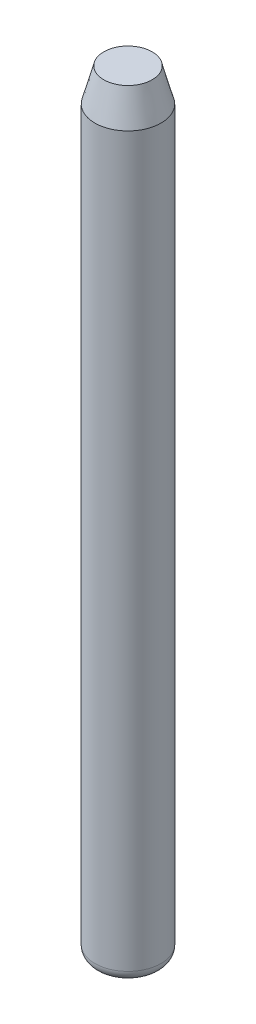
ISO-10303-21;
HEADER;
FILE_DESCRIPTION(('STEP AP214'),'2;1');
FILE_NAME('part.step','',(''),(''),'','','');
FILE_SCHEMA(('AUTOMOTIVE_DESIGN { 1 0 10303 214 1 1 1 1 }'));
ENDSEC;
DATA;
#1=APPLICATION_CONTEXT('core data for automotive mechanical design processes');
#2=APPLICATION_PROTOCOL_DEFINITION('international standard','automotive_design',2000,#1);
#3=PRODUCT_CONTEXT('',#1,'mechanical');
#4=PRODUCT('Part','Part','',(#3));
#5=PRODUCT_RELATED_PRODUCT_CATEGORY('part','',(#4));
#6=PRODUCT_DEFINITION_FORMATION('','',#4);
#7=PRODUCT_DEFINITION_CONTEXT('part definition',#1,'design');
#8=PRODUCT_DEFINITION('design','',#6,#7);
#9=PRODUCT_DEFINITION_SHAPE('','',#8);
#10=(LENGTH_UNIT() NAMED_UNIT(*) SI_UNIT(.MILLI.,.METRE.));
#11=(NAMED_UNIT(*) PLANE_ANGLE_UNIT() SI_UNIT($,.RADIAN.));
#12=(NAMED_UNIT(*) SI_UNIT($,.STERADIAN.) SOLID_ANGLE_UNIT());
#13=UNCERTAINTY_MEASURE_WITH_UNIT(LENGTH_MEASURE(1.E-05),#10,'distance_accuracy_value','');
#14=(GEOMETRIC_REPRESENTATION_CONTEXT(3) GLOBAL_UNCERTAINTY_ASSIGNED_CONTEXT((#13)) GLOBAL_UNIT_ASSIGNED_CONTEXT((#10,
#11,#12)) REPRESENTATION_CONTEXT('',''));
#15=CARTESIAN_POINT('',(0.,0.,0.));
#16=DIRECTION('',(0.,0.,1.));
#17=DIRECTION('',(1.,0.,0.));
#18=AXIS2_PLACEMENT_3D('',#15,#16,#17);
#19=CARTESIAN_POINT('',(0.,35.,0.));
#20=DIRECTION('',(0.,-1.,0.));
#21=DIRECTION('',(0.,0.,-1.));
#22=AXIS2_PLACEMENT_3D('',#19,#20,#21);
#23=CYLINDRICAL_SURFACE('',#22,1.5);
#24=CARTESIAN_POINT('',(0.,0.5,0.));
#25=DIRECTION('',(0.,1.,0.));
#26=DIRECTION('',(0.,0.,1.));
#27=AXIS2_PLACEMENT_3D('',#24,#25,#26);
#28=CIRCLE('',#27,1.5);
#29=CARTESIAN_POINT('',(0.,0.5,1.5));
#30=VERTEX_POINT('',#29);
#31=EDGE_CURVE('E38',#30,#30,#28,.T.);
#32=ORIENTED_EDGE('',*,*,#31,.T.);
#33=EDGE_LOOP('',(#32));
#34=FACE_BOUND('',#33,.T.);
#35=CARTESIAN_POINT('',(0.,33.5,0.));
#36=DIRECTION('',(0.,1.,0.));
#37=DIRECTION('',(0.,0.,1.));
#38=AXIS2_PLACEMENT_3D('',#35,#36,#37);
#39=CIRCLE('',#38,1.5);
#40=CARTESIAN_POINT('',(0.,33.5,1.5));
#41=VERTEX_POINT('',#40);
#42=EDGE_CURVE('E42',#41,#41,#39,.F.);
#43=ORIENTED_EDGE('',*,*,#42,.T.);
#44=EDGE_LOOP('',(#43));
#45=FACE_BOUND('',#44,.T.);
#46=ADVANCED_FACE('F31',(#34,#45),#23,.T.);
#47=CARTESIAN_POINT('',(0.,35.,0.));
#48=DIRECTION('',(0.,1.,0.));
#49=DIRECTION('',(0.,0.,1.));
#50=AXIS2_PLACEMENT_3D('',#47,#48,#49);
#51=PLANE('',#50);
#52=CARTESIAN_POINT('',(0.,35.,0.));
#53=DIRECTION('',(0.,1.,0.));
#54=DIRECTION('',(0.,0.,1.));
#55=AXIS2_PLACEMENT_3D('',#52,#53,#54);
#56=CIRCLE('',#55,1.09807621135332);
#57=CARTESIAN_POINT('',(0.,35.,1.09807621135332));
#58=VERTEX_POINT('',#57);
#59=EDGE_CURVE('E46',#58,#58,#56,.T.);
#60=ORIENTED_EDGE('',*,*,#59,.T.);
#61=EDGE_LOOP('',(#60));
#62=FACE_BOUND('',#61,.T.);
#63=ADVANCED_FACE('F52',(#62),#51,.T.);
#64=CARTESIAN_POINT('',(0.,0.,0.));
#65=DIRECTION('',(0.,1.,0.));
#66=DIRECTION('',(0.,0.,1.));
#67=AXIS2_PLACEMENT_3D('',#64,#65,#66);
#68=PLANE('',#67);
#69=CARTESIAN_POINT('',(0.,0.,0.));
#70=DIRECTION('',(0.,1.,0.));
#71=DIRECTION('',(0.,0.,1.));
#72=AXIS2_PLACEMENT_3D('',#69,#70,#71);
#73=CIRCLE('',#72,1.);
#74=CARTESIAN_POINT('',(0.,0.,1.));
#75=VERTEX_POINT('',#74);
#76=EDGE_CURVE('E10',#75,#75,#73,.F.);
#77=ORIENTED_EDGE('',*,*,#76,.T.);
#78=EDGE_LOOP('',(#77));
#79=FACE_BOUND('',#78,.T.);
#80=ADVANCED_FACE('F56',(#79),#68,.F.);
#81=CARTESIAN_POINT('',(0.,35.,0.));
#82=DIRECTION('',(0.,-1.,0.));
#83=DIRECTION('',(0.,0.,-1.));
#84=AXIS2_PLACEMENT_3D('',#81,#82,#83);
#85=CONICAL_SURFACE('',#84,1.09807621135332,0.261799387799147);
#86=ORIENTED_EDGE('',*,*,#42,.F.);
#87=EDGE_LOOP('',(#86));
#88=FACE_BOUND('',#87,.T.);
#89=ORIENTED_EDGE('',*,*,#59,.F.);
#90=EDGE_LOOP('',(#89));
#91=FACE_BOUND('',#90,.T.);
#92=ADVANCED_FACE('F54',(#88,#91),#85,.T.);
#93=CARTESIAN_POINT('',(0.,0.5,0.));
#94=DIRECTION('',(0.,1.,0.));
#95=DIRECTION('',(0.,0.,1.));
#96=AXIS2_PLACEMENT_3D('',#93,#94,#95);
#97=TOROIDAL_SURFACE('',#96,1.,0.5);
#98=ORIENTED_EDGE('',*,*,#76,.F.);
#99=EDGE_LOOP('',(#98));
#100=FACE_BOUND('',#99,.T.);
#101=ORIENTED_EDGE('',*,*,#31,.F.);
#102=EDGE_LOOP('',(#101));
#103=FACE_BOUND('',#102,.T.);
#104=ADVANCED_FACE('F33',(#100,#103),#97,.T.);
#105=CLOSED_SHELL('',(#46,#63,#80,#92,#104));
#106=MANIFOLD_SOLID_BREP('B2',#105);
#107=ADVANCED_BREP_SHAPE_REPRESENTATION('',(#18,#106),#14);
#108=SHAPE_DEFINITION_REPRESENTATION(#9,#107);
ENDSEC;
END-ISO-10303-21;
